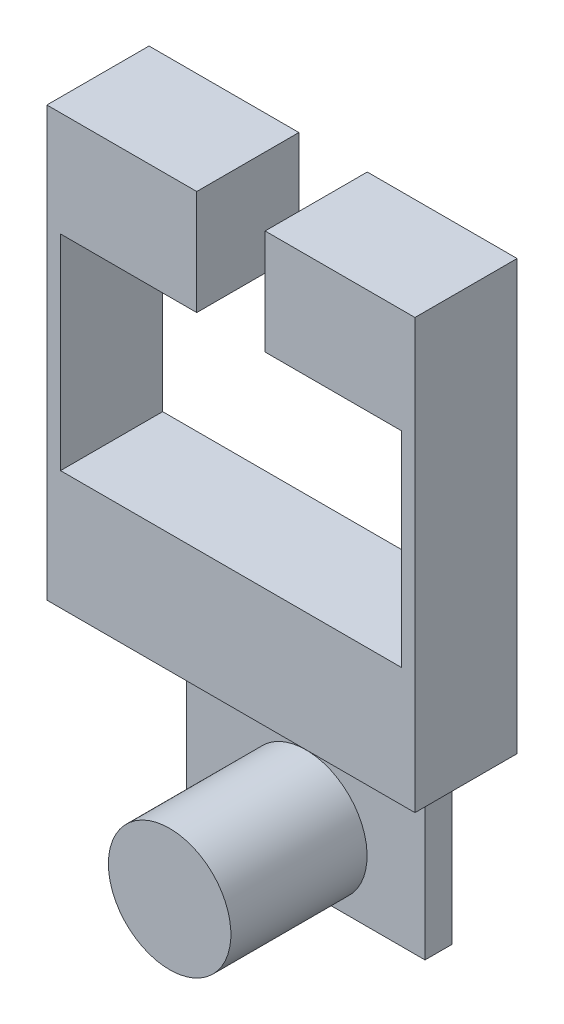
ISO-10303-21;
HEADER;
FILE_DESCRIPTION(('STEP AP214'),'2;1');
FILE_NAME('part.step','',(''),(''),'','','');
FILE_SCHEMA(('AUTOMOTIVE_DESIGN { 1 0 10303 214 1 1 1 1 }'));
ENDSEC;
DATA;
#1=APPLICATION_CONTEXT('core data for automotive mechanical design processes');
#2=APPLICATION_PROTOCOL_DEFINITION('international standard','automotive_design',2000,#1);
#3=PRODUCT_CONTEXT('',#1,'mechanical');
#4=PRODUCT('Part','Part','',(#3));
#5=PRODUCT_RELATED_PRODUCT_CATEGORY('part','',(#4));
#6=PRODUCT_DEFINITION_FORMATION('','',#4);
#7=PRODUCT_DEFINITION_CONTEXT('part definition',#1,'design');
#8=PRODUCT_DEFINITION('design','',#6,#7);
#9=PRODUCT_DEFINITION_SHAPE('','',#8);
#10=(LENGTH_UNIT() NAMED_UNIT(*) SI_UNIT(.MILLI.,.METRE.));
#11=(NAMED_UNIT(*) PLANE_ANGLE_UNIT() SI_UNIT($,.RADIAN.));
#12=(NAMED_UNIT(*) SI_UNIT($,.STERADIAN.) SOLID_ANGLE_UNIT());
#13=UNCERTAINTY_MEASURE_WITH_UNIT(LENGTH_MEASURE(1.E-05),#10,'distance_accuracy_value','');
#14=(GEOMETRIC_REPRESENTATION_CONTEXT(3) GLOBAL_UNCERTAINTY_ASSIGNED_CONTEXT((#13)) GLOBAL_UNIT_ASSIGNED_CONTEXT((#10,
#11,#12)) REPRESENTATION_CONTEXT('',''));
#15=CARTESIAN_POINT('',(0.,0.,0.));
#16=DIRECTION('',(0.,0.,1.));
#17=DIRECTION('',(1.,0.,0.));
#18=AXIS2_PLACEMENT_3D('',#15,#16,#17);
#19=CARTESIAN_POINT('',(-34.32048,0.,9.525));
#20=DIRECTION('',(0.,1.,0.));
#21=DIRECTION('',(0.,0.,1.));
#22=AXIS2_PLACEMENT_3D('',#19,#20,#21);
#23=PLANE('',#22);
#24=DIRECTION('',(0.,0.,-1.));
#25=VECTOR('',#24,1.);
#26=CARTESIAN_POINT('',(-22.225,0.,-4.445));
#27=LINE('',#26,#25);
#28=CARTESIAN_POINT('',(-22.225,0.,-4.445));
#29=VERTEX_POINT('',#28);
#30=CARTESIAN_POINT('',(-22.225,0.,-9.525));
#31=VERTEX_POINT('',#30);
#32=EDGE_CURVE('E193',#29,#31,#27,.T.);
#33=ORIENTED_EDGE('',*,*,#32,.F.);
#34=DIRECTION('',(1.,0.,0.));
#35=VECTOR('',#34,1.);
#36=CARTESIAN_POINT('',(22.225,0.,-4.445));
#37=LINE('',#36,#35);
#38=CARTESIAN_POINT('',(22.225,0.,-4.445));
#39=VERTEX_POINT('',#38);
#40=EDGE_CURVE('E166',#29,#39,#37,.T.);
#41=ORIENTED_EDGE('',*,*,#40,.T.);
#42=DIRECTION('',(0.,0.,-1.));
#43=VECTOR('',#42,1.);
#44=CARTESIAN_POINT('',(22.225,0.,-4.445));
#45=LINE('',#44,#43);
#46=CARTESIAN_POINT('',(22.225,0.,-9.525));
#47=VERTEX_POINT('',#46);
#48=EDGE_CURVE('E179',#39,#47,#45,.T.);
#49=ORIENTED_EDGE('',*,*,#48,.T.);
#50=DIRECTION('',(1.,0.,0.));
#51=VECTOR('',#50,1.);
#52=CARTESIAN_POINT('',(-34.32048,0.,-9.525));
#53=LINE('',#52,#51);
#54=CARTESIAN_POINT('',(34.32048,0.,-9.525));
#55=VERTEX_POINT('',#54);
#56=EDGE_CURVE('E266',#47,#55,#53,.T.);
#57=ORIENTED_EDGE('',*,*,#56,.T.);
#58=DIRECTION('',(0.,0.,-1.));
#59=VECTOR('',#58,1.);
#60=CARTESIAN_POINT('',(34.32048,0.,9.525));
#61=LINE('',#60,#59);
#62=CARTESIAN_POINT('',(34.32048,0.,9.525));
#63=VERTEX_POINT('',#62);
#64=EDGE_CURVE('E52',#63,#55,#61,.T.);
#65=ORIENTED_EDGE('',*,*,#64,.F.);
#66=DIRECTION('',(1.,0.,0.));
#67=VECTOR('',#66,1.);
#68=CARTESIAN_POINT('',(-34.32048,0.,9.525));
#69=LINE('',#68,#67);
#70=CARTESIAN_POINT('',(-34.32048,0.,9.525));
#71=VERTEX_POINT('',#70);
#72=EDGE_CURVE('E254',#71,#63,#69,.T.);
#73=ORIENTED_EDGE('',*,*,#72,.F.);
#74=DIRECTION('',(0.,0.,-1.));
#75=VECTOR('',#74,1.);
#76=CARTESIAN_POINT('',(-34.32048,0.,9.525));
#77=LINE('',#76,#75);
#78=CARTESIAN_POINT('',(-34.32048,0.,-9.525));
#79=VERTEX_POINT('',#78);
#80=EDGE_CURVE('E11',#71,#79,#77,.T.);
#81=ORIENTED_EDGE('',*,*,#80,.T.);
#82=EDGE_CURVE('E267',#79,#31,#53,.T.);
#83=ORIENTED_EDGE('',*,*,#82,.T.);
#84=EDGE_LOOP('',(#33,#41,#49,#57,#65,#73,#81,#83));
#85=FACE_BOUND('',#84,.T.);
#86=ADVANCED_FACE('F43',(#85),#23,.F.);
#87=CARTESIAN_POINT('',(-34.32048,79.9750208357062,9.525));
#88=DIRECTION('',(0.,-1.,0.));
#89=DIRECTION('',(0.,0.,-1.));
#90=AXIS2_PLACEMENT_3D('',#87,#88,#89);
#91=PLANE('',#90);
#92=DIRECTION('',(-1.,0.,0.));
#93=VECTOR('',#92,1.);
#94=CARTESIAN_POINT('',(-34.32048,79.9750208357062,9.525));
#95=LINE('',#94,#93);
#96=CARTESIAN_POINT('',(-6.3754,79.9750208357062,9.525));
#97=VERTEX_POINT('',#96);
#98=CARTESIAN_POINT('',(-34.32048,79.9750208357062,9.525));
#99=VERTEX_POINT('',#98);
#100=EDGE_CURVE('E259',#97,#99,#95,.T.);
#101=ORIENTED_EDGE('',*,*,#100,.F.);
#102=DIRECTION('',(0.,0.,1.));
#103=VECTOR('',#102,1.);
#104=CARTESIAN_POINT('',(-6.3754,79.9750208357062,-9.525));
#105=LINE('',#104,#103);
#106=CARTESIAN_POINT('',(-6.3754,79.9750208357062,-9.525));
#107=VERTEX_POINT('',#106);
#108=EDGE_CURVE('E206',#107,#97,#105,.T.);
#109=ORIENTED_EDGE('',*,*,#108,.F.);
#110=DIRECTION('',(-1.,0.,0.));
#111=VECTOR('',#110,1.);
#112=CARTESIAN_POINT('',(-34.32048,79.9750208357062,-9.525));
#113=LINE('',#112,#111);
#114=CARTESIAN_POINT('',(-34.32048,79.9750208357062,-9.525));
#115=VERTEX_POINT('',#114);
#116=EDGE_CURVE('E272',#107,#115,#113,.T.);
#117=ORIENTED_EDGE('',*,*,#116,.T.);
#118=DIRECTION('',(0.,0.,-1.));
#119=VECTOR('',#118,1.);
#120=CARTESIAN_POINT('',(-34.32048,79.9750208357062,9.525));
#121=LINE('',#120,#119);
#122=EDGE_CURVE('E263',#99,#115,#121,.T.);
#123=ORIENTED_EDGE('',*,*,#122,.F.);
#124=EDGE_LOOP('',(#101,#109,#117,#123));
#125=FACE_BOUND('',#124,.T.);
#126=ADVANCED_FACE('F324',(#125),#91,.F.);
#127=CARTESIAN_POINT('',(-31.78048,60.4170208357062,-9.525));
#128=DIRECTION('',(0.,1.,0.));
#129=DIRECTION('',(-1.,0.,0.));
#130=AXIS2_PLACEMENT_3D('',#127,#128,#129);
#131=PLANE('',#130);
#132=DIRECTION('',(-1.,0.,0.));
#133=VECTOR('',#132,1.);
#134=CARTESIAN_POINT('',(-31.78048,60.4170208357062,-9.525));
#135=LINE('',#134,#133);
#136=CARTESIAN_POINT('',(-6.3754,60.4170208357062,-9.525));
#137=VERTEX_POINT('',#136);
#138=CARTESIAN_POINT('',(-31.78048,60.4170208357062,-9.525));
#139=VERTEX_POINT('',#138);
#140=EDGE_CURVE('E226',#137,#139,#135,.T.);
#141=ORIENTED_EDGE('',*,*,#140,.F.);
#142=DIRECTION('',(0.,0.,1.));
#143=VECTOR('',#142,1.);
#144=CARTESIAN_POINT('',(-6.3754,60.4170208357062,-9.525));
#145=LINE('',#144,#143);
#146=CARTESIAN_POINT('',(-6.3754,60.4170208357062,9.525));
#147=VERTEX_POINT('',#146);
#148=EDGE_CURVE('E203',#137,#147,#145,.T.);
#149=ORIENTED_EDGE('',*,*,#148,.T.);
#150=DIRECTION('',(-1.,0.,0.));
#151=VECTOR('',#150,1.);
#152=CARTESIAN_POINT('',(-31.78048,60.4170208357062,9.525));
#153=LINE('',#152,#151);
#154=CARTESIAN_POINT('',(-31.78048,60.4170208357062,9.525));
#155=VERTEX_POINT('',#154);
#156=EDGE_CURVE('E238',#147,#155,#153,.T.);
#157=ORIENTED_EDGE('',*,*,#156,.T.);
#158=DIRECTION('',(0.,0.,1.));
#159=VECTOR('',#158,1.);
#160=CARTESIAN_POINT('',(-31.78048,60.4170208357062,-9.525));
#161=LINE('',#160,#159);
#162=EDGE_CURVE('E241',#139,#155,#161,.T.);
#163=ORIENTED_EDGE('',*,*,#162,.F.);
#164=EDGE_LOOP('',(#141,#149,#157,#163));
#165=FACE_BOUND('',#164,.T.);
#166=ADVANCED_FACE('F329',(#165),#131,.F.);
#167=CARTESIAN_POINT('',(-34.32048,79.9750208357062,9.525));
#168=DIRECTION('',(1.,0.,0.));
#169=DIRECTION('',(0.,1.,0.));
#170=AXIS2_PLACEMENT_3D('',#167,#168,#169);
#171=PLANE('',#170);
#172=DIRECTION('',(0.,-1.,0.));
#173=VECTOR('',#172,1.);
#174=CARTESIAN_POINT('',(-34.32048,79.9750208357062,-9.525));
#175=LINE('',#174,#173);
#176=EDGE_CURVE('E244',#115,#79,#175,.T.);
#177=ORIENTED_EDGE('',*,*,#176,.T.);
#178=ORIENTED_EDGE('',*,*,#80,.F.);
#179=DIRECTION('',(0.,-1.,0.));
#180=VECTOR('',#179,1.);
#181=CARTESIAN_POINT('',(-34.32048,79.9750208357062,9.525));
#182=LINE('',#181,#180);
#183=EDGE_CURVE('E251',#99,#71,#182,.T.);
#184=ORIENTED_EDGE('',*,*,#183,.F.);
#185=ORIENTED_EDGE('',*,*,#122,.T.);
#186=EDGE_LOOP('',(#177,#178,#184,#185));
#187=FACE_BOUND('',#186,.T.);
#188=ADVANCED_FACE('F45',(#187),#171,.F.);
#189=CARTESIAN_POINT('',(34.32048,79.9750208357062,9.525));
#190=DIRECTION('',(-1.,0.,0.));
#191=DIRECTION('',(0.,-1.,0.));
#192=AXIS2_PLACEMENT_3D('',#189,#190,#191);
#193=PLANE('',#192);
#194=DIRECTION('',(0.,1.,0.));
#195=VECTOR('',#194,1.);
#196=CARTESIAN_POINT('',(34.32048,79.9750208357062,-9.525));
#197=LINE('',#196,#195);
#198=CARTESIAN_POINT('',(34.32048,79.9750208357062,-9.525));
#199=VERTEX_POINT('',#198);
#200=EDGE_CURVE('E270',#55,#199,#197,.T.);
#201=ORIENTED_EDGE('',*,*,#200,.T.);
#202=DIRECTION('',(0.,0.,-1.));
#203=VECTOR('',#202,1.);
#204=CARTESIAN_POINT('',(34.32048,79.9750208357062,9.525));
#205=LINE('',#204,#203);
#206=CARTESIAN_POINT('',(34.32048,79.9750208357062,9.525));
#207=VERTEX_POINT('',#206);
#208=EDGE_CURVE('E277',#207,#199,#205,.T.);
#209=ORIENTED_EDGE('',*,*,#208,.F.);
#210=DIRECTION('',(0.,1.,0.));
#211=VECTOR('',#210,1.);
#212=CARTESIAN_POINT('',(34.32048,79.9750208357062,9.525));
#213=LINE('',#212,#211);
#214=EDGE_CURVE('E257',#63,#207,#213,.T.);
#215=ORIENTED_EDGE('',*,*,#214,.F.);
#216=ORIENTED_EDGE('',*,*,#64,.T.);
#217=EDGE_LOOP('',(#201,#209,#215,#216));
#218=FACE_BOUND('',#217,.T.);
#219=ADVANCED_FACE('F285',(#218),#193,.F.);
#220=CARTESIAN_POINT('',(6.3754,79.9750208357062,-9.525));
#221=VERTEX_POINT('',#220);
#222=EDGE_CURVE('E255',#199,#221,#113,.T.);
#223=ORIENTED_EDGE('',*,*,#222,.T.);
#224=DIRECTION('',(0.,0.,1.));
#225=VECTOR('',#224,1.);
#226=CARTESIAN_POINT('',(6.3754,79.9750208357062,-9.525));
#227=LINE('',#226,#225);
#228=CARTESIAN_POINT('',(6.3754,79.9750208357062,9.525));
#229=VERTEX_POINT('',#228);
#230=EDGE_CURVE('E209',#221,#229,#227,.T.);
#231=ORIENTED_EDGE('',*,*,#230,.T.);
#232=EDGE_CURVE('E260',#207,#229,#95,.T.);
#233=ORIENTED_EDGE('',*,*,#232,.F.);
#234=ORIENTED_EDGE('',*,*,#208,.T.);
#235=EDGE_LOOP('',(#223,#231,#233,#234));
#236=FACE_BOUND('',#235,.T.);
#237=ADVANCED_FACE('F293',(#236),#91,.F.);
#238=CARTESIAN_POINT('',(0.,0.,9.525));
#239=DIRECTION('',(0.,0.,1.));
#240=DIRECTION('',(1.,0.,0.));
#241=AXIS2_PLACEMENT_3D('',#238,#239,#240);
#242=PLANE('',#241);
#243=DIRECTION('',(0.,-1.,0.));
#244=VECTOR('',#243,1.);
#245=CARTESIAN_POINT('',(-6.3754,79.9750208357062,9.525));
#246=LINE('',#245,#244);
#247=EDGE_CURVE('E192',#97,#147,#246,.T.);
#248=ORIENTED_EDGE('',*,*,#247,.F.);
#249=ORIENTED_EDGE('',*,*,#100,.T.);
#250=ORIENTED_EDGE('',*,*,#183,.T.);
#251=ORIENTED_EDGE('',*,*,#72,.T.);
#252=ORIENTED_EDGE('',*,*,#214,.T.);
#253=ORIENTED_EDGE('',*,*,#232,.T.);
#254=DIRECTION('',(0.,1.,0.));
#255=VECTOR('',#254,1.);
#256=CARTESIAN_POINT('',(6.3754,79.9750208357062,9.525));
#257=LINE('',#256,#255);
#258=CARTESIAN_POINT('',(6.3754,60.4170208357062,9.525));
#259=VERTEX_POINT('',#258);
#260=EDGE_CURVE('E200',#259,#229,#257,.T.);
#261=ORIENTED_EDGE('',*,*,#260,.F.);
#262=CARTESIAN_POINT('',(31.78048,60.4170208357062,9.525));
#263=VERTEX_POINT('',#262);
#264=EDGE_CURVE('E220',#263,#259,#153,.T.);
#265=ORIENTED_EDGE('',*,*,#264,.F.);
#266=DIRECTION('',(0.,1.,0.));
#267=VECTOR('',#266,1.);
#268=CARTESIAN_POINT('',(31.78048,60.4170208357062,9.525));
#269=LINE('',#268,#267);
#270=CARTESIAN_POINT('',(31.78048,22.1900208357063,9.525));
#271=VERTEX_POINT('',#270);
#272=EDGE_CURVE('E235',#271,#263,#269,.T.);
#273=ORIENTED_EDGE('',*,*,#272,.F.);
#274=DIRECTION('',(1.,0.,0.));
#275=VECTOR('',#274,1.);
#276=CARTESIAN_POINT('',(-31.78048,22.1900208357062,9.525));
#277=LINE('',#276,#275);
#278=CARTESIAN_POINT('',(-31.78048,22.1900208357062,9.525));
#279=VERTEX_POINT('',#278);
#280=EDGE_CURVE('E232',#279,#271,#277,.T.);
#281=ORIENTED_EDGE('',*,*,#280,.F.);
#282=DIRECTION('',(0.,-1.,0.));
#283=VECTOR('',#282,1.);
#284=CARTESIAN_POINT('',(-31.78048,60.4170208357062,9.525));
#285=LINE('',#284,#283);
#286=EDGE_CURVE('E208',#155,#279,#285,.T.);
#287=ORIENTED_EDGE('',*,*,#286,.F.);
#288=ORIENTED_EDGE('',*,*,#156,.F.);
#289=EDGE_LOOP('',(#248,#249,#250,#251,#252,#253,#261,#265,#273,#281,#287,#288));
#290=FACE_BOUND('',#289,.T.);
#291=ADVANCED_FACE('F298',(#290),#242,.T.);
#292=CARTESIAN_POINT('',(0.,0.,-9.525));
#293=DIRECTION('',(0.,0.,1.));
#294=DIRECTION('',(1.,0.,0.));
#295=AXIS2_PLACEMENT_3D('',#292,#293,#294);
#296=PLANE('',#295);
#297=DIRECTION('',(-1.,0.,0.));
#298=VECTOR('',#297,1.);
#299=CARTESIAN_POINT('',(22.225,-36.82365,-9.525));
#300=LINE('',#299,#298);
#301=CARTESIAN_POINT('',(22.225,-36.82365,-9.525));
#302=VERTEX_POINT('',#301);
#303=CARTESIAN_POINT('',(-22.225,-36.82365,-9.525));
#304=VERTEX_POINT('',#303);
#305=EDGE_CURVE('E163',#302,#304,#300,.T.);
#306=ORIENTED_EDGE('',*,*,#305,.T.);
#307=DIRECTION('',(0.,1.,0.));
#308=VECTOR('',#307,1.);
#309=CARTESIAN_POINT('',(-22.225,0.,-9.525));
#310=LINE('',#309,#308);
#311=EDGE_CURVE('E180',#304,#31,#310,.T.);
#312=ORIENTED_EDGE('',*,*,#311,.T.);
#313=ORIENTED_EDGE('',*,*,#82,.F.);
#314=ORIENTED_EDGE('',*,*,#176,.F.);
#315=ORIENTED_EDGE('',*,*,#116,.F.);
#316=DIRECTION('',(0.,-1.,0.));
#317=VECTOR('',#316,1.);
#318=CARTESIAN_POINT('',(-6.3754,79.9750208357062,-9.525));
#319=LINE('',#318,#317);
#320=EDGE_CURVE('E196',#107,#137,#319,.T.);
#321=ORIENTED_EDGE('',*,*,#320,.T.);
#322=ORIENTED_EDGE('',*,*,#140,.T.);
#323=DIRECTION('',(0.,-1.,0.));
#324=VECTOR('',#323,1.);
#325=CARTESIAN_POINT('',(-31.78048,60.4170208357062,-9.525));
#326=LINE('',#325,#324);
#327=CARTESIAN_POINT('',(-31.78048,22.1900208357062,-9.525));
#328=VERTEX_POINT('',#327);
#329=EDGE_CURVE('E216',#139,#328,#326,.T.);
#330=ORIENTED_EDGE('',*,*,#329,.T.);
#331=DIRECTION('',(1.,0.,0.));
#332=VECTOR('',#331,1.);
#333=CARTESIAN_POINT('',(-31.78048,22.1900208357062,-9.525));
#334=LINE('',#333,#332);
#335=CARTESIAN_POINT('',(31.78048,22.1900208357063,-9.525));
#336=VERTEX_POINT('',#335);
#337=EDGE_CURVE('E219',#328,#336,#334,.T.);
#338=ORIENTED_EDGE('',*,*,#337,.T.);
#339=DIRECTION('',(0.,1.,0.));
#340=VECTOR('',#339,1.);
#341=CARTESIAN_POINT('',(31.78048,60.4170208357062,-9.525));
#342=LINE('',#341,#340);
#343=CARTESIAN_POINT('',(31.78048,60.4170208357062,-9.525));
#344=VERTEX_POINT('',#343);
#345=EDGE_CURVE('E223',#336,#344,#342,.T.);
#346=ORIENTED_EDGE('',*,*,#345,.T.);
#347=CARTESIAN_POINT('',(6.3754,60.4170208357062,-9.525));
#348=VERTEX_POINT('',#347);
#349=EDGE_CURVE('E227',#344,#348,#135,.T.);
#350=ORIENTED_EDGE('',*,*,#349,.T.);
#351=DIRECTION('',(0.,1.,0.));
#352=VECTOR('',#351,1.);
#353=CARTESIAN_POINT('',(6.3754,79.9750208357062,-9.525));
#354=LINE('',#353,#352);
#355=EDGE_CURVE('E199',#348,#221,#354,.T.);
#356=ORIENTED_EDGE('',*,*,#355,.T.);
#357=ORIENTED_EDGE('',*,*,#222,.F.);
#358=ORIENTED_EDGE('',*,*,#200,.F.);
#359=ORIENTED_EDGE('',*,*,#56,.F.);
#360=DIRECTION('',(0.,-1.,0.));
#361=VECTOR('',#360,1.);
#362=CARTESIAN_POINT('',(22.225,0.,-9.525));
#363=LINE('',#362,#361);
#364=EDGE_CURVE('E63',#47,#302,#363,.T.);
#365=ORIENTED_EDGE('',*,*,#364,.T.);
#366=EDGE_LOOP('',(#306,#312,#313,#314,#315,#321,#322,#330,#338,#346,#350,#356,#357,#358,#359,#365));
#367=FACE_BOUND('',#366,.T.);
#368=ADVANCED_FACE('F291',(#367),#296,.F.);
#369=CARTESIAN_POINT('',(-31.78048,60.4170208357062,-9.525));
#370=DIRECTION('',(-1.,0.,0.));
#371=DIRECTION('',(0.,-1.,0.));
#372=AXIS2_PLACEMENT_3D('',#369,#370,#371);
#373=PLANE('',#372);
#374=ORIENTED_EDGE('',*,*,#286,.T.);
#375=DIRECTION('',(0.,0.,1.));
#376=VECTOR('',#375,1.);
#377=CARTESIAN_POINT('',(-31.78048,22.1900208357062,-9.525));
#378=LINE('',#377,#376);
#379=EDGE_CURVE('E230',#328,#279,#378,.T.);
#380=ORIENTED_EDGE('',*,*,#379,.F.);
#381=ORIENTED_EDGE('',*,*,#329,.F.);
#382=ORIENTED_EDGE('',*,*,#162,.T.);
#383=EDGE_LOOP('',(#374,#380,#381,#382));
#384=FACE_BOUND('',#383,.T.);
#385=ADVANCED_FACE('F337',(#384),#373,.F.);
#386=ORIENTED_EDGE('',*,*,#264,.T.);
#387=DIRECTION('',(0.,0.,1.));
#388=VECTOR('',#387,1.);
#389=CARTESIAN_POINT('',(6.3754,60.4170208357062,-9.525));
#390=LINE('',#389,#388);
#391=EDGE_CURVE('E212',#348,#259,#390,.T.);
#392=ORIENTED_EDGE('',*,*,#391,.F.);
#393=ORIENTED_EDGE('',*,*,#349,.F.);
#394=DIRECTION('',(0.,0.,1.));
#395=VECTOR('',#394,1.);
#396=CARTESIAN_POINT('',(31.78048,60.4170208357062,-9.525));
#397=LINE('',#396,#395);
#398=EDGE_CURVE('E245',#344,#263,#397,.T.);
#399=ORIENTED_EDGE('',*,*,#398,.T.);
#400=EDGE_LOOP('',(#386,#392,#393,#399));
#401=FACE_BOUND('',#400,.T.);
#402=ADVANCED_FACE('F342',(#401),#131,.F.);
#403=CARTESIAN_POINT('',(31.78048,60.4170208357062,-9.525));
#404=DIRECTION('',(1.,0.,0.));
#405=DIRECTION('',(0.,1.,0.));
#406=AXIS2_PLACEMENT_3D('',#403,#404,#405);
#407=PLANE('',#406);
#408=ORIENTED_EDGE('',*,*,#272,.T.);
#409=ORIENTED_EDGE('',*,*,#398,.F.);
#410=ORIENTED_EDGE('',*,*,#345,.F.);
#411=DIRECTION('',(0.,0.,1.));
#412=VECTOR('',#411,1.);
#413=CARTESIAN_POINT('',(31.78048,22.1900208357063,-9.525));
#414=LINE('',#413,#412);
#415=EDGE_CURVE('E247',#336,#271,#414,.T.);
#416=ORIENTED_EDGE('',*,*,#415,.T.);
#417=EDGE_LOOP('',(#408,#409,#410,#416));
#418=FACE_BOUND('',#417,.T.);
#419=ADVANCED_FACE('F348',(#418),#407,.F.);
#420=CARTESIAN_POINT('',(-31.78048,22.1900208357062,-9.525));
#421=DIRECTION('',(0.,-1.,0.));
#422=DIRECTION('',(1.,0.,0.));
#423=AXIS2_PLACEMENT_3D('',#420,#421,#422);
#424=PLANE('',#423);
#425=ORIENTED_EDGE('',*,*,#280,.T.);
#426=ORIENTED_EDGE('',*,*,#415,.F.);
#427=ORIENTED_EDGE('',*,*,#337,.F.);
#428=ORIENTED_EDGE('',*,*,#379,.T.);
#429=EDGE_LOOP('',(#425,#426,#427,#428));
#430=FACE_BOUND('',#429,.T.);
#431=ADVANCED_FACE('F344',(#430),#424,.F.);
#432=CARTESIAN_POINT('',(6.3754,79.9750208357062,-9.525));
#433=DIRECTION('',(1.,0.,0.));
#434=DIRECTION('',(0.,1.,0.));
#435=AXIS2_PLACEMENT_3D('',#432,#433,#434);
#436=PLANE('',#435);
#437=ORIENTED_EDGE('',*,*,#260,.T.);
#438=ORIENTED_EDGE('',*,*,#230,.F.);
#439=ORIENTED_EDGE('',*,*,#355,.F.);
#440=ORIENTED_EDGE('',*,*,#391,.T.);
#441=EDGE_LOOP('',(#437,#438,#439,#440));
#442=FACE_BOUND('',#441,.T.);
#443=ADVANCED_FACE('F347',(#442),#436,.F.);
#444=CARTESIAN_POINT('',(-6.3754,79.9750208357062,-9.525));
#445=DIRECTION('',(-1.,0.,0.));
#446=DIRECTION('',(0.,-1.,0.));
#447=AXIS2_PLACEMENT_3D('',#444,#445,#446);
#448=PLANE('',#447);
#449=ORIENTED_EDGE('',*,*,#247,.T.);
#450=ORIENTED_EDGE('',*,*,#148,.F.);
#451=ORIENTED_EDGE('',*,*,#320,.F.);
#452=ORIENTED_EDGE('',*,*,#108,.T.);
#453=EDGE_LOOP('',(#449,#450,#451,#452));
#454=FACE_BOUND('',#453,.T.);
#455=ADVANCED_FACE('F320',(#454),#448,.F.);
#456=CARTESIAN_POINT('',(22.225,0.,-4.445));
#457=DIRECTION('',(1.,0.,0.));
#458=DIRECTION('',(0.,1.,0.));
#459=AXIS2_PLACEMENT_3D('',#456,#457,#458);
#460=PLANE('',#459);
#461=ORIENTED_EDGE('',*,*,#364,.F.);
#462=ORIENTED_EDGE('',*,*,#48,.F.);
#463=DIRECTION('',(0.,-1.,0.));
#464=VECTOR('',#463,1.);
#465=CARTESIAN_POINT('',(22.225,0.,-4.445));
#466=LINE('',#465,#464);
#467=CARTESIAN_POINT('',(22.225,-36.82365,-4.445));
#468=VERTEX_POINT('',#467);
#469=EDGE_CURVE('E173',#39,#468,#466,.T.);
#470=ORIENTED_EDGE('',*,*,#469,.T.);
#471=DIRECTION('',(0.,0.,-1.));
#472=VECTOR('',#471,1.);
#473=CARTESIAN_POINT('',(22.225,-36.82365,-4.445));
#474=LINE('',#473,#472);
#475=EDGE_CURVE('E158',#468,#302,#474,.T.);
#476=ORIENTED_EDGE('',*,*,#475,.T.);
#477=EDGE_LOOP('',(#461,#462,#470,#476));
#478=FACE_BOUND('',#477,.T.);
#479=ADVANCED_FACE('F178',(#478),#460,.T.);
#480=CARTESIAN_POINT('',(-22.225,0.,-4.445));
#481=DIRECTION('',(-1.,0.,0.));
#482=DIRECTION('',(0.,-1.,0.));
#483=AXIS2_PLACEMENT_3D('',#480,#481,#482);
#484=PLANE('',#483);
#485=ORIENTED_EDGE('',*,*,#311,.F.);
#486=DIRECTION('',(0.,0.,-1.));
#487=VECTOR('',#486,1.);
#488=CARTESIAN_POINT('',(-22.225,-36.82365,-4.445));
#489=LINE('',#488,#487);
#490=CARTESIAN_POINT('',(-22.225,-36.82365,-4.445));
#491=VERTEX_POINT('',#490);
#492=EDGE_CURVE('E165',#491,#304,#489,.T.);
#493=ORIENTED_EDGE('',*,*,#492,.F.);
#494=DIRECTION('',(0.,1.,0.));
#495=VECTOR('',#494,1.);
#496=CARTESIAN_POINT('',(-22.225,0.,-4.445));
#497=LINE('',#496,#495);
#498=EDGE_CURVE('E175',#491,#29,#497,.T.);
#499=ORIENTED_EDGE('',*,*,#498,.T.);
#500=ORIENTED_EDGE('',*,*,#32,.T.);
#501=EDGE_LOOP('',(#485,#493,#499,#500));
#502=FACE_BOUND('',#501,.T.);
#503=ADVANCED_FACE('F310',(#502),#484,.T.);
#504=CARTESIAN_POINT('',(22.225,-36.82365,-4.445));
#505=DIRECTION('',(0.,-1.,0.));
#506=DIRECTION('',(1.,0.,0.));
#507=AXIS2_PLACEMENT_3D('',#504,#505,#506);
#508=PLANE('',#507);
#509=ORIENTED_EDGE('',*,*,#492,.T.);
#510=ORIENTED_EDGE('',*,*,#305,.F.);
#511=ORIENTED_EDGE('',*,*,#475,.F.);
#512=DIRECTION('',(-1.,0.,0.));
#513=VECTOR('',#512,1.);
#514=CARTESIAN_POINT('',(22.225,-36.82365,-4.445));
#515=LINE('',#514,#513);
#516=CARTESIAN_POINT('',(0.,-36.82365,-4.445));
#517=VERTEX_POINT('',#516);
#518=EDGE_CURVE('E162',#468,#517,#515,.T.);
#519=ORIENTED_EDGE('',*,*,#518,.T.);
#520=EDGE_CURVE('E176',#517,#491,#515,.T.);
#521=ORIENTED_EDGE('',*,*,#520,.T.);
#522=EDGE_LOOP('',(#509,#510,#511,#519,#521));
#523=FACE_BOUND('',#522,.T.);
#524=ADVANCED_FACE('F161',(#523),#508,.T.);
#525=CARTESIAN_POINT('',(0.,0.,-4.445));
#526=DIRECTION('',(0.,0.,-1.));
#527=DIRECTION('',(-1.,0.,0.));
#528=AXIS2_PLACEMENT_3D('',#525,#526,#527);
#529=PLANE('',#528);
#530=ORIENTED_EDGE('',*,*,#520,.F.);
#531=CARTESIAN_POINT('',(0.,-25.4,-4.445));
#532=DIRECTION('',(0.,0.,-1.));
#533=DIRECTION('',(-1.,0.,0.));
#534=AXIS2_PLACEMENT_3D('',#531,#532,#533);
#535=CIRCLE('',#534,11.42365);
#536=EDGE_CURVE('E47',#517,#517,#535,.T.);
#537=ORIENTED_EDGE('',*,*,#536,.T.);
#538=ORIENTED_EDGE('',*,*,#518,.F.);
#539=ORIENTED_EDGE('',*,*,#469,.F.);
#540=ORIENTED_EDGE('',*,*,#40,.F.);
#541=ORIENTED_EDGE('',*,*,#498,.F.);
#542=EDGE_LOOP('',(#530,#537,#538,#539,#540,#541));
#543=FACE_BOUND('',#542,.T.);
#544=ADVANCED_FACE('F171',(#543),#529,.F.);
#545=CARTESIAN_POINT('',(0.,-25.4,20.955));
#546=DIRECTION('',(0.,0.,-1.));
#547=DIRECTION('',(-1.,0.,0.));
#548=AXIS2_PLACEMENT_3D('',#545,#546,#547);
#549=CYLINDRICAL_SURFACE('',#548,11.42365);
#550=CARTESIAN_POINT('',(0.,-25.4,20.955));
#551=DIRECTION('',(0.,0.,-1.));
#552=DIRECTION('',(-1.,0.,0.));
#553=AXIS2_PLACEMENT_3D('',#550,#551,#552);
#554=CIRCLE('',#553,11.42365);
#555=CARTESIAN_POINT('',(-11.42365,-25.4,20.955));
#556=VERTEX_POINT('',#555);
#557=EDGE_CURVE('E185',#556,#556,#554,.T.);
#558=ORIENTED_EDGE('',*,*,#557,.T.);
#559=EDGE_LOOP('',(#558));
#560=FACE_BOUND('',#559,.T.);
#561=ORIENTED_EDGE('',*,*,#536,.F.);
#562=EDGE_LOOP('',(#561));
#563=FACE_BOUND('',#562,.T.);
#564=ADVANCED_FACE('F449',(#560,#563),#549,.T.);
#565=CARTESIAN_POINT('',(0.,-25.4,20.955));
#566=DIRECTION('',(0.,0.,-1.));
#567=DIRECTION('',(-1.,0.,0.));
#568=AXIS2_PLACEMENT_3D('',#565,#566,#567);
#569=PLANE('',#568);
#570=ORIENTED_EDGE('',*,*,#557,.F.);
#571=EDGE_LOOP('',(#570));
#572=FACE_BOUND('',#571,.T.);
#573=ADVANCED_FACE('F456',(#572),#569,.F.);
#574=CLOSED_SHELL('',(#86,#126,#166,#188,#219,#237,#291,#368,#385,#402,#419,#431,#443,#455,#479,
#503,#524,#544,#564,#573));
#575=MANIFOLD_SOLID_BREP('B2',#574);
#576=ADVANCED_BREP_SHAPE_REPRESENTATION('',(#18,#575),#14);
#577=SHAPE_DEFINITION_REPRESENTATION(#9,#576);
ENDSEC;
END-ISO-10303-21;
